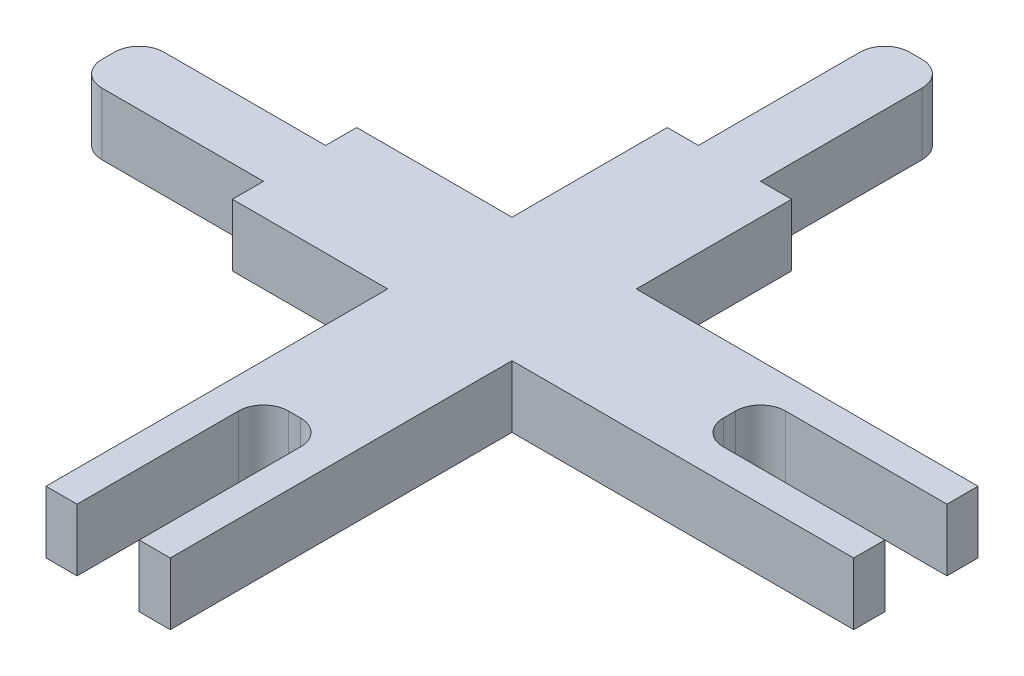
ISO-10303-21;
HEADER;
FILE_DESCRIPTION(('STEP AP214'),'2;1');
FILE_NAME('part.step','',(''),(''),'','','');
FILE_SCHEMA(('AUTOMOTIVE_DESIGN { 1 0 10303 214 1 1 1 1 }'));
ENDSEC;
DATA;
#1=APPLICATION_CONTEXT('core data for automotive mechanical design processes');
#2=APPLICATION_PROTOCOL_DEFINITION('international standard','automotive_design',2000,#1);
#3=PRODUCT_CONTEXT('',#1,'mechanical');
#4=PRODUCT('Part','Part','',(#3));
#5=PRODUCT_RELATED_PRODUCT_CATEGORY('part','',(#4));
#6=PRODUCT_DEFINITION_FORMATION('','',#4);
#7=PRODUCT_DEFINITION_CONTEXT('part definition',#1,'design');
#8=PRODUCT_DEFINITION('design','',#6,#7);
#9=PRODUCT_DEFINITION_SHAPE('','',#8);
#10=(LENGTH_UNIT() NAMED_UNIT(*) SI_UNIT(.MILLI.,.METRE.));
#11=(NAMED_UNIT(*) PLANE_ANGLE_UNIT() SI_UNIT($,.RADIAN.));
#12=(NAMED_UNIT(*) SI_UNIT($,.STERADIAN.) SOLID_ANGLE_UNIT());
#13=UNCERTAINTY_MEASURE_WITH_UNIT(LENGTH_MEASURE(1.E-05),#10,'distance_accuracy_value','');
#14=(GEOMETRIC_REPRESENTATION_CONTEXT(3) GLOBAL_UNCERTAINTY_ASSIGNED_CONTEXT((#13)) GLOBAL_UNIT_ASSIGNED_CONTEXT((#10,
#11,#12)) REPRESENTATION_CONTEXT('',''));
#15=CARTESIAN_POINT('',(0.,0.,0.));
#16=DIRECTION('',(0.,0.,1.));
#17=DIRECTION('',(1.,0.,0.));
#18=AXIS2_PLACEMENT_3D('',#15,#16,#17);
#19=CARTESIAN_POINT('',(0.,2.5,0.));
#20=DIRECTION('',(0.,0.,-1.));
#21=DIRECTION('',(-1.,0.,0.));
#22=AXIS2_PLACEMENT_3D('',#19,#20,#21);
#23=PLANE('',#22);
#24=DIRECTION('',(1.,0.,0.));
#25=VECTOR('',#24,1.);
#26=CARTESIAN_POINT('',(0.,2.5,0.));
#27=LINE('',#26,#25);
#28=CARTESIAN_POINT('',(22.5,2.5,0.));
#29=VERTEX_POINT('',#28);
#30=CARTESIAN_POINT('',(50.,2.5,0.));
#31=VERTEX_POINT('',#30);
#32=EDGE_CURVE('E600',#29,#31,#27,.T.);
#33=ORIENTED_EDGE('',*,*,#32,.F.);
#34=DIRECTION('',(0.,-1.,0.));
#35=VECTOR('',#34,1.);
#36=CARTESIAN_POINT('',(22.5,2.5,0.));
#37=LINE('',#36,#35);
#38=CARTESIAN_POINT('',(22.5,-2.5,0.));
#39=VERTEX_POINT('',#38);
#40=EDGE_CURVE('E472',#29,#39,#37,.T.);
#41=ORIENTED_EDGE('',*,*,#40,.T.);
#42=DIRECTION('',(1.,0.,0.));
#43=VECTOR('',#42,1.);
#44=CARTESIAN_POINT('',(0.,-2.5,0.));
#45=LINE('',#44,#43);
#46=CARTESIAN_POINT('',(50.,-2.5,0.));
#47=VERTEX_POINT('',#46);
#48=EDGE_CURVE('E616',#39,#47,#45,.T.);
#49=ORIENTED_EDGE('',*,*,#48,.T.);
#50=DIRECTION('',(0.,-1.,0.));
#51=VECTOR('',#50,1.);
#52=CARTESIAN_POINT('',(50.,2.5,0.));
#53=LINE('',#52,#51);
#54=EDGE_CURVE('E639',#31,#47,#53,.T.);
#55=ORIENTED_EDGE('',*,*,#54,.F.);
#56=EDGE_LOOP('',(#33,#41,#49,#55));
#57=FACE_BOUND('',#56,.T.);
#58=ADVANCED_FACE('F44',(#57),#23,.F.);
#59=CARTESIAN_POINT('',(0.,2.5,-10.));
#60=DIRECTION('',(0.,0.,1.));
#61=DIRECTION('',(1.,0.,0.));
#62=AXIS2_PLACEMENT_3D('',#59,#60,#61);
#63=PLANE('',#62);
#64=DIRECTION('',(-1.,0.,0.));
#65=VECTOR('',#64,1.);
#66=CARTESIAN_POINT('',(0.,-2.5,-10.));
#67=LINE('',#66,#65);
#68=CARTESIAN_POINT('',(50.,-2.5,-10.));
#69=VERTEX_POINT('',#68);
#70=CARTESIAN_POINT('',(22.5,-2.5,-10.));
#71=VERTEX_POINT('',#70);
#72=EDGE_CURVE('E628',#69,#71,#67,.T.);
#73=ORIENTED_EDGE('',*,*,#72,.T.);
#74=DIRECTION('',(0.,1.,0.));
#75=VECTOR('',#74,1.);
#76=CARTESIAN_POINT('',(22.5,2.5,-10.));
#77=LINE('',#76,#75);
#78=CARTESIAN_POINT('',(22.5,2.5,-10.));
#79=VERTEX_POINT('',#78);
#80=EDGE_CURVE('E11',#71,#79,#77,.T.);
#81=ORIENTED_EDGE('',*,*,#80,.T.);
#82=DIRECTION('',(-1.,0.,0.));
#83=VECTOR('',#82,1.);
#84=CARTESIAN_POINT('',(0.,2.5,-10.));
#85=LINE('',#84,#83);
#86=CARTESIAN_POINT('',(50.,2.5,-10.));
#87=VERTEX_POINT('',#86);
#88=EDGE_CURVE('E606',#87,#79,#85,.T.);
#89=ORIENTED_EDGE('',*,*,#88,.F.);
#90=DIRECTION('',(0.,-1.,0.));
#91=VECTOR('',#90,1.);
#92=CARTESIAN_POINT('',(50.,2.5,-10.));
#93=LINE('',#92,#91);
#94=EDGE_CURVE('E638',#87,#69,#93,.T.);
#95=ORIENTED_EDGE('',*,*,#94,.T.);
#96=EDGE_LOOP('',(#73,#81,#89,#95));
#97=FACE_BOUND('',#96,.T.);
#98=ADVANCED_FACE('F687',(#97),#63,.F.);
#99=CARTESIAN_POINT('',(0.,2.5,0.));
#100=DIRECTION('',(1.,0.,0.));
#101=DIRECTION('',(0.,0.,-1.));
#102=AXIS2_PLACEMENT_3D('',#99,#100,#101);
#103=PLANE('',#102);
#104=DIRECTION('',(0.,1.,0.));
#105=VECTOR('',#104,1.);
#106=CARTESIAN_POINT('',(0.,-2.5,-2.5));
#107=LINE('',#106,#105);
#108=CARTESIAN_POINT('',(0.,-2.5,-2.5));
#109=VERTEX_POINT('',#108);
#110=CARTESIAN_POINT('',(0.,2.5,-2.5));
#111=VERTEX_POINT('',#110);
#112=EDGE_CURVE('E519',#109,#111,#107,.T.);
#113=ORIENTED_EDGE('',*,*,#112,.F.);
#114=DIRECTION('',(0.,0.,1.));
#115=VECTOR('',#114,1.);
#116=CARTESIAN_POINT('',(0.,-2.5,0.));
#117=LINE('',#116,#115);
#118=CARTESIAN_POINT('',(0.,-2.5,0.));
#119=VERTEX_POINT('',#118);
#120=EDGE_CURVE('E576',#109,#119,#117,.T.);
#121=ORIENTED_EDGE('',*,*,#120,.T.);
#122=DIRECTION('',(0.,-1.,0.));
#123=VECTOR('',#122,1.);
#124=CARTESIAN_POINT('',(0.,2.5,0.));
#125=LINE('',#124,#123);
#126=CARTESIAN_POINT('',(0.,2.5,0.));
#127=VERTEX_POINT('',#126);
#128=EDGE_CURVE('E644',#127,#119,#125,.T.);
#129=ORIENTED_EDGE('',*,*,#128,.F.);
#130=DIRECTION('',(0.,0.,1.));
#131=VECTOR('',#130,1.);
#132=CARTESIAN_POINT('',(0.,2.5,0.));
#133=LINE('',#132,#131);
#134=EDGE_CURVE('E598',#111,#127,#133,.T.);
#135=ORIENTED_EDGE('',*,*,#134,.F.);
#136=EDGE_LOOP('',(#113,#121,#129,#135));
#137=FACE_BOUND('',#136,.T.);
#138=ADVANCED_FACE('F758',(#137),#103,.F.);
#139=CARTESIAN_POINT('',(50.,2.5,0.));
#140=DIRECTION('',(-1.,0.,0.));
#141=DIRECTION('',(0.,0.,1.));
#142=AXIS2_PLACEMENT_3D('',#139,#140,#141);
#143=PLANE('',#142);
#144=DIRECTION('',(0.,1.,0.));
#145=VECTOR('',#144,1.);
#146=CARTESIAN_POINT('',(50.,-2.5,-7.5));
#147=LINE('',#146,#145);
#148=CARTESIAN_POINT('',(50.,-2.5,-7.5));
#149=VERTEX_POINT('',#148);
#150=CARTESIAN_POINT('',(50.,2.5,-7.5));
#151=VERTEX_POINT('',#150);
#152=EDGE_CURVE('E559',#149,#151,#147,.T.);
#153=ORIENTED_EDGE('',*,*,#152,.F.);
#154=DIRECTION('',(0.,0.,-1.));
#155=VECTOR('',#154,1.);
#156=CARTESIAN_POINT('',(50.,-2.5,0.));
#157=LINE('',#156,#155);
#158=EDGE_CURVE('E621',#149,#69,#157,.T.);
#159=ORIENTED_EDGE('',*,*,#158,.T.);
#160=ORIENTED_EDGE('',*,*,#94,.F.);
#161=DIRECTION('',(0.,0.,-1.));
#162=VECTOR('',#161,1.);
#163=CARTESIAN_POINT('',(50.,2.5,0.));
#164=LINE('',#163,#162);
#165=EDGE_CURVE('E602',#151,#87,#164,.T.);
#166=ORIENTED_EDGE('',*,*,#165,.F.);
#167=EDGE_LOOP('',(#153,#159,#160,#166));
#168=FACE_BOUND('',#167,.T.);
#169=ADVANCED_FACE('F695',(#168),#143,.F.);
#170=CARTESIAN_POINT('',(0.,2.5,0.));
#171=DIRECTION('',(0.,-1.,0.));
#172=DIRECTION('',(0.,0.,-1.));
#173=AXIS2_PLACEMENT_3D('',#170,#171,#172);
#174=PLANE('',#173);
#175=ORIENTED_EDGE('',*,*,#88,.T.);
#176=DIRECTION('',(0.,0.,-1.));
#177=VECTOR('',#176,1.);
#178=CARTESIAN_POINT('',(22.5,2.5,-22.5));
#179=LINE('',#178,#177);
#180=CARTESIAN_POINT('',(22.5,2.5,-22.5));
#181=VERTEX_POINT('',#180);
#182=EDGE_CURVE('E314',#79,#181,#179,.T.);
#183=ORIENTED_EDGE('',*,*,#182,.T.);
#184=DIRECTION('',(-1.,0.,0.));
#185=VECTOR('',#184,1.);
#186=CARTESIAN_POINT('',(20.,2.5,-22.5));
#187=LINE('',#186,#185);
#188=CARTESIAN_POINT('',(20.,2.5,-22.5));
#189=VERTEX_POINT('',#188);
#190=EDGE_CURVE('E369',#181,#189,#187,.T.);
#191=ORIENTED_EDGE('',*,*,#190,.T.);
#192=DIRECTION('',(0.,0.,-1.));
#193=VECTOR('',#192,1.);
#194=CARTESIAN_POINT('',(20.,2.5,-35.5));
#195=LINE('',#194,#193);
#196=CARTESIAN_POINT('',(20.,2.5,-35.5));
#197=VERTEX_POINT('',#196);
#198=EDGE_CURVE('E283',#189,#197,#195,.T.);
#199=ORIENTED_EDGE('',*,*,#198,.T.);
#200=CARTESIAN_POINT('',(18.,2.5,-35.5));
#201=DIRECTION('',(0.,1.,0.));
#202=DIRECTION('',(0.,0.,-1.));
#203=AXIS2_PLACEMENT_3D('',#200,#201,#202);
#204=CIRCLE('',#203,2.);
#205=CARTESIAN_POINT('',(18.,2.5,-37.5));
#206=VERTEX_POINT('',#205);
#207=EDGE_CURVE('E372',#197,#206,#204,.T.);
#208=ORIENTED_EDGE('',*,*,#207,.T.);
#209=DIRECTION('',(-1.,0.,0.));
#210=VECTOR('',#209,1.);
#211=CARTESIAN_POINT('',(17.,2.5,-37.5));
#212=LINE('',#211,#210);
#213=CARTESIAN_POINT('',(17.,2.5,-37.5));
#214=VERTEX_POINT('',#213);
#215=EDGE_CURVE('E378',#206,#214,#212,.T.);
#216=ORIENTED_EDGE('',*,*,#215,.T.);
#217=CARTESIAN_POINT('',(17.,2.5,-35.5));
#218=DIRECTION('',(0.,1.,0.));
#219=DIRECTION('',(0.,0.,1.));
#220=AXIS2_PLACEMENT_3D('',#217,#218,#219);
#221=CIRCLE('',#220,2.);
#222=CARTESIAN_POINT('',(15.,2.5,-35.5));
#223=VERTEX_POINT('',#222);
#224=EDGE_CURVE('E385',#214,#223,#221,.T.);
#225=ORIENTED_EDGE('',*,*,#224,.T.);
#226=DIRECTION('',(0.,0.,1.));
#227=VECTOR('',#226,1.);
#228=CARTESIAN_POINT('',(15.,2.5,-22.5));
#229=LINE('',#228,#227);
#230=CARTESIAN_POINT('',(15.,2.5,-22.5));
#231=VERTEX_POINT('',#230);
#232=EDGE_CURVE('E387',#223,#231,#229,.T.);
#233=ORIENTED_EDGE('',*,*,#232,.T.);
#234=DIRECTION('',(-1.,0.,0.));
#235=VECTOR('',#234,1.);
#236=CARTESIAN_POINT('',(12.5,2.5,-22.5));
#237=LINE('',#236,#235);
#238=CARTESIAN_POINT('',(12.5,2.5,-22.5));
#239=VERTEX_POINT('',#238);
#240=EDGE_CURVE('E388',#231,#239,#237,.T.);
#241=ORIENTED_EDGE('',*,*,#240,.T.);
#242=DIRECTION('',(0.,0.,1.));
#243=VECTOR('',#242,1.);
#244=CARTESIAN_POINT('',(12.5,2.5,27.5));
#245=LINE('',#244,#243);
#246=CARTESIAN_POINT('',(12.5,2.5,-10.));
#247=VERTEX_POINT('',#246);
#248=EDGE_CURVE('E393',#239,#247,#245,.T.);
#249=ORIENTED_EDGE('',*,*,#248,.T.);
#250=CARTESIAN_POINT('',(0.,2.5,-10.));
#251=VERTEX_POINT('',#250);
#252=EDGE_CURVE('E609',#247,#251,#85,.T.);
#253=ORIENTED_EDGE('',*,*,#252,.T.);
#254=CARTESIAN_POINT('',(0.,2.5,-7.5));
#255=VERTEX_POINT('',#254);
#256=EDGE_CURVE('E593',#251,#255,#133,.T.);
#257=ORIENTED_EDGE('',*,*,#256,.T.);
#258=DIRECTION('',(-1.,0.,0.));
#259=VECTOR('',#258,1.);
#260=CARTESIAN_POINT('',(0.,2.5,-7.5));
#261=LINE('',#260,#259);
#262=CARTESIAN_POINT('',(-13.,2.5,-7.5));
#263=VERTEX_POINT('',#262);
#264=EDGE_CURVE('E478',#255,#263,#261,.T.);
#265=ORIENTED_EDGE('',*,*,#264,.T.);
#266=CARTESIAN_POINT('',(-13.,2.5,-5.5));
#267=DIRECTION('',(0.,1.,0.));
#268=DIRECTION('',(0.,0.,1.));
#269=AXIS2_PLACEMENT_3D('',#266,#267,#268);
#270=CIRCLE('',#269,2.);
#271=CARTESIAN_POINT('',(-15.,2.5,-5.49999999999998));
#272=VERTEX_POINT('',#271);
#273=EDGE_CURVE('E504',#263,#272,#270,.T.);
#274=ORIENTED_EDGE('',*,*,#273,.T.);
#275=DIRECTION('',(0.,0.,1.));
#276=VECTOR('',#275,1.);
#277=CARTESIAN_POINT('',(-15.,2.5,-4.50000000000001));
#278=LINE('',#277,#276);
#279=CARTESIAN_POINT('',(-15.,2.5,-4.50000000000001));
#280=VERTEX_POINT('',#279);
#281=EDGE_CURVE('E502',#272,#280,#278,.T.);
#282=ORIENTED_EDGE('',*,*,#281,.T.);
#283=CARTESIAN_POINT('',(-13.,2.5,-4.5));
#284=DIRECTION('',(0.,1.,0.));
#285=DIRECTION('',(0.,0.,-1.));
#286=AXIS2_PLACEMENT_3D('',#283,#284,#285);
#287=CIRCLE('',#286,2.);
#288=CARTESIAN_POINT('',(-13.,2.5,-2.5));
#289=VERTEX_POINT('',#288);
#290=EDGE_CURVE('E507',#280,#289,#287,.T.);
#291=ORIENTED_EDGE('',*,*,#290,.T.);
#292=DIRECTION('',(1.,0.,0.));
#293=VECTOR('',#292,1.);
#294=CARTESIAN_POINT('',(0.,2.5,-2.5));
#295=LINE('',#294,#293);
#296=EDGE_CURVE('E485',#289,#111,#295,.T.);
#297=ORIENTED_EDGE('',*,*,#296,.T.);
#298=ORIENTED_EDGE('',*,*,#134,.T.);
#299=CARTESIAN_POINT('',(12.5,2.5,0.));
#300=VERTEX_POINT('',#299);
#301=EDGE_CURVE('E597',#127,#300,#27,.T.);
#302=ORIENTED_EDGE('',*,*,#301,.T.);
#303=CARTESIAN_POINT('',(12.5,2.5,27.5));
#304=VERTEX_POINT('',#303);
#305=EDGE_CURVE('E64',#300,#304,#245,.T.);
#306=ORIENTED_EDGE('',*,*,#305,.T.);
#307=DIRECTION('',(1.,0.,0.));
#308=VECTOR('',#307,1.);
#309=CARTESIAN_POINT('',(15.,2.5,27.5));
#310=LINE('',#309,#308);
#311=CARTESIAN_POINT('',(15.,2.5,27.5));
#312=VERTEX_POINT('',#311);
#313=EDGE_CURVE('E396',#304,#312,#310,.T.);
#314=ORIENTED_EDGE('',*,*,#313,.T.);
#315=DIRECTION('',(0.,0.,-1.));
#316=VECTOR('',#315,1.);
#317=CARTESIAN_POINT('',(15.,2.5,14.5));
#318=LINE('',#317,#316);
#319=CARTESIAN_POINT('',(15.,2.5,14.5));
#320=VERTEX_POINT('',#319);
#321=EDGE_CURVE('E405',#312,#320,#318,.T.);
#322=ORIENTED_EDGE('',*,*,#321,.T.);
#323=CARTESIAN_POINT('',(17.,2.5,14.5));
#324=DIRECTION('',(0.,-1.,0.));
#325=DIRECTION('',(0.,0.,1.));
#326=AXIS2_PLACEMENT_3D('',#323,#324,#325);
#327=CIRCLE('',#326,2.);
#328=CARTESIAN_POINT('',(17.,2.5,12.5));
#329=VERTEX_POINT('',#328);
#330=EDGE_CURVE('E409',#320,#329,#327,.T.);
#331=ORIENTED_EDGE('',*,*,#330,.T.);
#332=DIRECTION('',(1.,0.,0.));
#333=VECTOR('',#332,1.);
#334=CARTESIAN_POINT('',(18.,2.5,12.5));
#335=LINE('',#334,#333);
#336=CARTESIAN_POINT('',(18.,2.5,12.5));
#337=VERTEX_POINT('',#336);
#338=EDGE_CURVE('E407',#329,#337,#335,.T.);
#339=ORIENTED_EDGE('',*,*,#338,.T.);
#340=CARTESIAN_POINT('',(18.,2.5,14.5));
#341=DIRECTION('',(0.,-1.,0.));
#342=DIRECTION('',(0.,0.,1.));
#343=AXIS2_PLACEMENT_3D('',#340,#341,#342);
#344=CIRCLE('',#343,2.);
#345=CARTESIAN_POINT('',(20.,2.5,14.5));
#346=VERTEX_POINT('',#345);
#347=EDGE_CURVE('E412',#337,#346,#344,.T.);
#348=ORIENTED_EDGE('',*,*,#347,.T.);
#349=DIRECTION('',(0.,0.,1.));
#350=VECTOR('',#349,1.);
#351=CARTESIAN_POINT('',(20.,2.5,27.5));
#352=LINE('',#351,#350);
#353=CARTESIAN_POINT('',(20.,2.5,27.5));
#354=VERTEX_POINT('',#353);
#355=EDGE_CURVE('E416',#346,#354,#352,.T.);
#356=ORIENTED_EDGE('',*,*,#355,.T.);
#357=DIRECTION('',(1.,0.,0.));
#358=VECTOR('',#357,1.);
#359=CARTESIAN_POINT('',(22.5,2.5,27.5));
#360=LINE('',#359,#358);
#361=CARTESIAN_POINT('',(22.5,2.5,27.5));
#362=VERTEX_POINT('',#361);
#363=EDGE_CURVE('E425',#354,#362,#360,.T.);
#364=ORIENTED_EDGE('',*,*,#363,.T.);
#365=EDGE_CURVE('E309',#362,#29,#179,.T.);
#366=ORIENTED_EDGE('',*,*,#365,.T.);
#367=ORIENTED_EDGE('',*,*,#32,.T.);
#368=CARTESIAN_POINT('',(50.,2.5,-2.5));
#369=VERTEX_POINT('',#368);
#370=EDGE_CURVE('E603',#31,#369,#164,.T.);
#371=ORIENTED_EDGE('',*,*,#370,.T.);
#372=DIRECTION('',(1.,0.,0.));
#373=VECTOR('',#372,1.);
#374=CARTESIAN_POINT('',(50.,2.5,-2.5));
#375=LINE('',#374,#373);
#376=CARTESIAN_POINT('',(37.,2.5,-2.5));
#377=VERTEX_POINT('',#376);
#378=EDGE_CURVE('E539',#377,#369,#375,.T.);
#379=ORIENTED_EDGE('',*,*,#378,.F.);
#380=CARTESIAN_POINT('',(37.,2.5,-4.5));
#381=DIRECTION('',(0.,1.,0.));
#382=DIRECTION('',(0.,0.,-1.));
#383=AXIS2_PLACEMENT_3D('',#380,#381,#382);
#384=CIRCLE('',#383,2.);
#385=CARTESIAN_POINT('',(35.,2.5,-4.50000000000002));
#386=VERTEX_POINT('',#385);
#387=EDGE_CURVE('E566',#386,#377,#384,.T.);
#388=ORIENTED_EDGE('',*,*,#387,.F.);
#389=DIRECTION('',(0.,0.,1.));
#390=VECTOR('',#389,1.);
#391=CARTESIAN_POINT('',(35.,2.5,-5.49999999999998));
#392=LINE('',#391,#390);
#393=CARTESIAN_POINT('',(35.,2.5,-5.49999999999998));
#394=VERTEX_POINT('',#393);
#395=EDGE_CURVE('E562',#394,#386,#392,.T.);
#396=ORIENTED_EDGE('',*,*,#395,.F.);
#397=CARTESIAN_POINT('',(37.,2.5,-5.5));
#398=DIRECTION('',(0.,1.,0.));
#399=DIRECTION('',(0.,0.,1.));
#400=AXIS2_PLACEMENT_3D('',#397,#398,#399);
#401=CIRCLE('',#400,2.);
#402=CARTESIAN_POINT('',(37.,2.5,-7.5));
#403=VERTEX_POINT('',#402);
#404=EDGE_CURVE('E557',#403,#394,#401,.T.);
#405=ORIENTED_EDGE('',*,*,#404,.F.);
#406=DIRECTION('',(-1.,0.,0.));
#407=VECTOR('',#406,1.);
#408=CARTESIAN_POINT('',(50.,2.5,-7.5));
#409=LINE('',#408,#407);
#410=EDGE_CURVE('E518',#151,#403,#409,.T.);
#411=ORIENTED_EDGE('',*,*,#410,.F.);
#412=ORIENTED_EDGE('',*,*,#165,.T.);
#413=EDGE_LOOP('',(#175,#183,#191,#199,#208,#216,#225,#233,#241,#249,#253,#257,#265,#274,#282,
#291,#297,#298,#302,#306,#314,#322,#331,#339,#348,#356,#364,#366,#367,#371,#379,#388,#396,#405,
#411,#412));
#414=FACE_BOUND('',#413,.T.);
#415=ADVANCED_FACE('F679',(#414),#174,.F.);
#416=CARTESIAN_POINT('',(0.,-2.5,0.));
#417=DIRECTION('',(0.,-1.,0.));
#418=DIRECTION('',(0.,0.,-1.));
#419=AXIS2_PLACEMENT_3D('',#416,#417,#418);
#420=PLANE('',#419);
#421=CARTESIAN_POINT('',(12.5,-2.5,-10.));
#422=VERTEX_POINT('',#421);
#423=CARTESIAN_POINT('',(0.,-2.5,-10.));
#424=VERTEX_POINT('',#423);
#425=EDGE_CURVE('E630',#422,#424,#67,.T.);
#426=ORIENTED_EDGE('',*,*,#425,.F.);
#427=DIRECTION('',(0.,0.,1.));
#428=VECTOR('',#427,1.);
#429=CARTESIAN_POINT('',(12.5,-2.5,27.5));
#430=LINE('',#429,#428);
#431=CARTESIAN_POINT('',(12.5,-2.5,-22.5));
#432=VERTEX_POINT('',#431);
#433=EDGE_CURVE('E67',#432,#422,#430,.T.);
#434=ORIENTED_EDGE('',*,*,#433,.F.);
#435=DIRECTION('',(-1.,0.,0.));
#436=VECTOR('',#435,1.);
#437=CARTESIAN_POINT('',(12.5,-2.5,-22.5));
#438=LINE('',#437,#436);
#439=CARTESIAN_POINT('',(15.,-2.5,-22.5));
#440=VERTEX_POINT('',#439);
#441=EDGE_CURVE('E332',#440,#432,#438,.T.);
#442=ORIENTED_EDGE('',*,*,#441,.F.);
#443=DIRECTION('',(0.,0.,1.));
#444=VECTOR('',#443,1.);
#445=CARTESIAN_POINT('',(15.,-2.5,-22.5));
#446=LINE('',#445,#444);
#447=CARTESIAN_POINT('',(15.,-2.5,-35.5));
#448=VERTEX_POINT('',#447);
#449=EDGE_CURVE('E330',#448,#440,#446,.T.);
#450=ORIENTED_EDGE('',*,*,#449,.F.);
#451=CARTESIAN_POINT('',(17.,-2.5,-35.5));
#452=DIRECTION('',(0.,1.,0.));
#453=DIRECTION('',(0.,0.,1.));
#454=AXIS2_PLACEMENT_3D('',#451,#452,#453);
#455=CIRCLE('',#454,2.);
#456=CARTESIAN_POINT('',(17.,-2.5,-37.5));
#457=VERTEX_POINT('',#456);
#458=EDGE_CURVE('E323',#457,#448,#455,.T.);
#459=ORIENTED_EDGE('',*,*,#458,.F.);
#460=DIRECTION('',(-1.,0.,0.));
#461=VECTOR('',#460,1.);
#462=CARTESIAN_POINT('',(17.,-2.5,-37.5));
#463=LINE('',#462,#461);
#464=CARTESIAN_POINT('',(18.,-2.5,-37.5));
#465=VERTEX_POINT('',#464);
#466=EDGE_CURVE('E317',#465,#457,#463,.T.);
#467=ORIENTED_EDGE('',*,*,#466,.F.);
#468=CARTESIAN_POINT('',(18.,-2.5,-35.5));
#469=DIRECTION('',(0.,1.,0.));
#470=DIRECTION('',(0.,0.,-1.));
#471=AXIS2_PLACEMENT_3D('',#468,#469,#470);
#472=CIRCLE('',#471,2.);
#473=CARTESIAN_POINT('',(20.,-2.5,-35.5));
#474=VERTEX_POINT('',#473);
#475=EDGE_CURVE('E305',#474,#465,#472,.T.);
#476=ORIENTED_EDGE('',*,*,#475,.F.);
#477=DIRECTION('',(0.,0.,-1.));
#478=VECTOR('',#477,1.);
#479=CARTESIAN_POINT('',(20.,-2.5,-35.5));
#480=LINE('',#479,#478);
#481=CARTESIAN_POINT('',(20.,-2.5,-22.5));
#482=VERTEX_POINT('',#481);
#483=EDGE_CURVE('E281',#482,#474,#480,.T.);
#484=ORIENTED_EDGE('',*,*,#483,.F.);
#485=DIRECTION('',(-1.,0.,0.));
#486=VECTOR('',#485,1.);
#487=CARTESIAN_POINT('',(20.,-2.5,-22.5));
#488=LINE('',#487,#486);
#489=CARTESIAN_POINT('',(22.5,-2.5,-22.5));
#490=VERTEX_POINT('',#489);
#491=EDGE_CURVE('E298',#490,#482,#488,.T.);
#492=ORIENTED_EDGE('',*,*,#491,.F.);
#493=DIRECTION('',(0.,0.,-1.));
#494=VECTOR('',#493,1.);
#495=CARTESIAN_POINT('',(22.5,-2.5,-22.5));
#496=LINE('',#495,#494);
#497=EDGE_CURVE('E368',#71,#490,#496,.T.);
#498=ORIENTED_EDGE('',*,*,#497,.F.);
#499=ORIENTED_EDGE('',*,*,#72,.F.);
#500=ORIENTED_EDGE('',*,*,#158,.F.);
#501=DIRECTION('',(-1.,0.,0.));
#502=VECTOR('',#501,1.);
#503=CARTESIAN_POINT('',(50.,-2.5,-7.5));
#504=LINE('',#503,#502);
#505=CARTESIAN_POINT('',(37.,-2.5,-7.5));
#506=VERTEX_POINT('',#505);
#507=EDGE_CURVE('E532',#149,#506,#504,.T.);
#508=ORIENTED_EDGE('',*,*,#507,.T.);
#509=CARTESIAN_POINT('',(37.,-2.5,-5.5));
#510=DIRECTION('',(0.,1.,0.));
#511=DIRECTION('',(0.,0.,1.));
#512=AXIS2_PLACEMENT_3D('',#509,#510,#511);
#513=CIRCLE('',#512,2.);
#514=CARTESIAN_POINT('',(35.,-2.5,-5.49999999999998));
#515=VERTEX_POINT('',#514);
#516=EDGE_CURVE('E537',#506,#515,#513,.T.);
#517=ORIENTED_EDGE('',*,*,#516,.T.);
#518=DIRECTION('',(0.,0.,1.));
#519=VECTOR('',#518,1.);
#520=CARTESIAN_POINT('',(35.,-2.5,-5.49999999999998));
#521=LINE('',#520,#519);
#522=CARTESIAN_POINT('',(35.,-2.5,-4.50000000000002));
#523=VERTEX_POINT('',#522);
#524=EDGE_CURVE('E542',#515,#523,#521,.T.);
#525=ORIENTED_EDGE('',*,*,#524,.T.);
#526=CARTESIAN_POINT('',(37.,-2.5,-4.5));
#527=DIRECTION('',(0.,1.,0.));
#528=DIRECTION('',(0.,0.,-1.));
#529=AXIS2_PLACEMENT_3D('',#526,#527,#528);
#530=CIRCLE('',#529,2.);
#531=CARTESIAN_POINT('',(37.,-2.5,-2.5));
#532=VERTEX_POINT('',#531);
#533=EDGE_CURVE('E547',#523,#532,#530,.T.);
#534=ORIENTED_EDGE('',*,*,#533,.T.);
#535=DIRECTION('',(1.,0.,0.));
#536=VECTOR('',#535,1.);
#537=CARTESIAN_POINT('',(50.,-2.5,-2.5));
#538=LINE('',#537,#536);
#539=CARTESIAN_POINT('',(50.,-2.5,-2.5));
#540=VERTEX_POINT('',#539);
#541=EDGE_CURVE('E555',#532,#540,#538,.T.);
#542=ORIENTED_EDGE('',*,*,#541,.T.);
#543=EDGE_CURVE('E624',#47,#540,#157,.T.);
#544=ORIENTED_EDGE('',*,*,#543,.F.);
#545=ORIENTED_EDGE('',*,*,#48,.F.);
#546=CARTESIAN_POINT('',(22.5,-2.5,27.5));
#547=VERTEX_POINT('',#546);
#548=EDGE_CURVE('E292',#547,#39,#496,.T.);
#549=ORIENTED_EDGE('',*,*,#548,.F.);
#550=DIRECTION('',(1.,0.,0.));
#551=VECTOR('',#550,1.);
#552=CARTESIAN_POINT('',(22.5,-2.5,27.5));
#553=LINE('',#552,#551);
#554=CARTESIAN_POINT('',(20.,-2.5,27.5));
#555=VERTEX_POINT('',#554);
#556=EDGE_CURVE('E362',#555,#547,#553,.T.);
#557=ORIENTED_EDGE('',*,*,#556,.F.);
#558=DIRECTION('',(0.,0.,1.));
#559=VECTOR('',#558,1.);
#560=CARTESIAN_POINT('',(20.,-2.5,27.5));
#561=LINE('',#560,#559);
#562=CARTESIAN_POINT('',(20.,-2.5,14.5));
#563=VERTEX_POINT('',#562);
#564=EDGE_CURVE('E356',#563,#555,#561,.T.);
#565=ORIENTED_EDGE('',*,*,#564,.F.);
#566=CARTESIAN_POINT('',(18.,-2.5,14.5));
#567=DIRECTION('',(0.,-1.,0.));
#568=DIRECTION('',(0.,0.,1.));
#569=AXIS2_PLACEMENT_3D('',#566,#567,#568);
#570=CIRCLE('',#569,2.);
#571=CARTESIAN_POINT('',(18.,-2.5,12.5));
#572=VERTEX_POINT('',#571);
#573=EDGE_CURVE('E353',#572,#563,#570,.T.);
#574=ORIENTED_EDGE('',*,*,#573,.F.);
#575=DIRECTION('',(1.,0.,0.));
#576=VECTOR('',#575,1.);
#577=CARTESIAN_POINT('',(18.,-2.5,12.5));
#578=LINE('',#577,#576);
#579=CARTESIAN_POINT('',(17.,-2.5,12.5));
#580=VERTEX_POINT('',#579);
#581=EDGE_CURVE('E348',#580,#572,#578,.T.);
#582=ORIENTED_EDGE('',*,*,#581,.F.);
#583=CARTESIAN_POINT('',(17.,-2.5,14.5));
#584=DIRECTION('',(0.,-1.,0.));
#585=DIRECTION('',(0.,0.,1.));
#586=AXIS2_PLACEMENT_3D('',#583,#584,#585);
#587=CIRCLE('',#586,2.);
#588=CARTESIAN_POINT('',(15.,-2.5,14.5));
#589=VERTEX_POINT('',#588);
#590=EDGE_CURVE('E347',#589,#580,#587,.T.);
#591=ORIENTED_EDGE('',*,*,#590,.F.);
#592=DIRECTION('',(0.,0.,-1.));
#593=VECTOR('',#592,1.);
#594=CARTESIAN_POINT('',(15.,-2.5,14.5));
#595=LINE('',#594,#593);
#596=CARTESIAN_POINT('',(15.,-2.5,27.5));
#597=VERTEX_POINT('',#596);
#598=EDGE_CURVE('E345',#597,#589,#595,.T.);
#599=ORIENTED_EDGE('',*,*,#598,.F.);
#600=DIRECTION('',(1.,0.,0.));
#601=VECTOR('',#600,1.);
#602=CARTESIAN_POINT('',(15.,-2.5,27.5));
#603=LINE('',#602,#601);
#604=CARTESIAN_POINT('',(12.5,-2.5,27.5));
#605=VERTEX_POINT('',#604);
#606=EDGE_CURVE('E340',#605,#597,#603,.T.);
#607=ORIENTED_EDGE('',*,*,#606,.F.);
#608=CARTESIAN_POINT('',(12.5,-2.5,0.));
#609=VERTEX_POINT('',#608);
#610=EDGE_CURVE('E333',#609,#605,#430,.T.);
#611=ORIENTED_EDGE('',*,*,#610,.F.);
#612=EDGE_CURVE('E617',#119,#609,#45,.T.);
#613=ORIENTED_EDGE('',*,*,#612,.F.);
#614=ORIENTED_EDGE('',*,*,#120,.F.);
#615=DIRECTION('',(1.,0.,0.));
#616=VECTOR('',#615,1.);
#617=CARTESIAN_POINT('',(0.,-2.5,-2.5));
#618=LINE('',#617,#616);
#619=CARTESIAN_POINT('',(-13.,-2.5,-2.5));
#620=VERTEX_POINT('',#619);
#621=EDGE_CURVE('E493',#620,#109,#618,.T.);
#622=ORIENTED_EDGE('',*,*,#621,.F.);
#623=CARTESIAN_POINT('',(-13.,-2.5,-4.5));
#624=DIRECTION('',(0.,1.,0.));
#625=DIRECTION('',(0.,0.,-1.));
#626=AXIS2_PLACEMENT_3D('',#623,#624,#625);
#627=CIRCLE('',#626,2.);
#628=CARTESIAN_POINT('',(-15.,-2.5,-4.50000000000001));
#629=VERTEX_POINT('',#628);
#630=EDGE_CURVE('E489',#629,#620,#627,.T.);
#631=ORIENTED_EDGE('',*,*,#630,.F.);
#632=DIRECTION('',(0.,0.,1.));
#633=VECTOR('',#632,1.);
#634=CARTESIAN_POINT('',(-15.,-2.5,-4.50000000000001));
#635=LINE('',#634,#633);
#636=CARTESIAN_POINT('',(-15.,-2.5,-5.49999999999998));
#637=VERTEX_POINT('',#636);
#638=EDGE_CURVE('E486',#637,#629,#635,.T.);
#639=ORIENTED_EDGE('',*,*,#638,.F.);
#640=CARTESIAN_POINT('',(-13.,-2.5,-5.5));
#641=DIRECTION('',(0.,1.,0.));
#642=DIRECTION('',(0.,0.,1.));
#643=AXIS2_PLACEMENT_3D('',#640,#641,#642);
#644=CIRCLE('',#643,2.);
#645=CARTESIAN_POINT('',(-13.,-2.5,-7.5));
#646=VERTEX_POINT('',#645);
#647=EDGE_CURVE('E481',#646,#637,#644,.T.);
#648=ORIENTED_EDGE('',*,*,#647,.F.);
#649=DIRECTION('',(-1.,0.,0.));
#650=VECTOR('',#649,1.);
#651=CARTESIAN_POINT('',(0.,-2.5,-7.5));
#652=LINE('',#651,#650);
#653=CARTESIAN_POINT('',(0.,-2.5,-7.5));
#654=VERTEX_POINT('',#653);
#655=EDGE_CURVE('E480',#654,#646,#652,.T.);
#656=ORIENTED_EDGE('',*,*,#655,.F.);
#657=EDGE_CURVE('E613',#424,#654,#117,.T.);
#658=ORIENTED_EDGE('',*,*,#657,.F.);
#659=EDGE_LOOP('',(#426,#434,#442,#450,#459,#467,#476,#484,#492,#498,#499,#500,#508,#517,#525,
#534,#542,#544,#545,#549,#557,#565,#574,#582,#591,#599,#607,#611,#613,#614,#622,#631,#639,#648,
#656,#658));
#660=FACE_BOUND('',#659,.T.);
#661=ADVANCED_FACE('F296',(#660),#420,.T.);
#662=ORIENTED_EDGE('',*,*,#657,.T.);
#663=DIRECTION('',(0.,1.,0.));
#664=VECTOR('',#663,1.);
#665=CARTESIAN_POINT('',(0.,-2.5,-7.5));
#666=LINE('',#665,#664);
#667=EDGE_CURVE('E500',#654,#255,#666,.T.);
#668=ORIENTED_EDGE('',*,*,#667,.T.);
#669=ORIENTED_EDGE('',*,*,#256,.F.);
#670=DIRECTION('',(0.,-1.,0.));
#671=VECTOR('',#670,1.);
#672=CARTESIAN_POINT('',(0.,2.5,-10.));
#673=LINE('',#672,#671);
#674=EDGE_CURVE('E615',#251,#424,#673,.T.);
#675=ORIENTED_EDGE('',*,*,#674,.T.);
#676=EDGE_LOOP('',(#662,#668,#669,#675));
#677=FACE_BOUND('',#676,.T.);
#678=ADVANCED_FACE('F50',(#677),#103,.F.);
#679=ORIENTED_EDGE('',*,*,#612,.T.);
#680=DIRECTION('',(0.,1.,0.));
#681=VECTOR('',#680,1.);
#682=CARTESIAN_POINT('',(12.5,2.5,0.));
#683=LINE('',#682,#681);
#684=EDGE_CURVE('E428',#609,#300,#683,.T.);
#685=ORIENTED_EDGE('',*,*,#684,.T.);
#686=ORIENTED_EDGE('',*,*,#301,.F.);
#687=ORIENTED_EDGE('',*,*,#128,.T.);
#688=EDGE_LOOP('',(#679,#685,#686,#687));
#689=FACE_BOUND('',#688,.T.);
#690=ADVANCED_FACE('F751',(#689),#23,.F.);
#691=ORIENTED_EDGE('',*,*,#543,.T.);
#692=DIRECTION('',(0.,1.,0.));
#693=VECTOR('',#692,1.);
#694=CARTESIAN_POINT('',(50.,-2.5,-2.5));
#695=LINE('',#694,#693);
#696=EDGE_CURVE('E573',#540,#369,#695,.T.);
#697=ORIENTED_EDGE('',*,*,#696,.T.);
#698=ORIENTED_EDGE('',*,*,#370,.F.);
#699=ORIENTED_EDGE('',*,*,#54,.T.);
#700=EDGE_LOOP('',(#691,#697,#698,#699));
#701=FACE_BOUND('',#700,.T.);
#702=ADVANCED_FACE('F720',(#701),#143,.F.);
#703=ORIENTED_EDGE('',*,*,#252,.F.);
#704=DIRECTION('',(0.,-1.,0.));
#705=VECTOR('',#704,1.);
#706=CARTESIAN_POINT('',(12.5,2.5,-10.));
#707=LINE('',#706,#705);
#708=EDGE_CURVE('E53',#247,#422,#707,.T.);
#709=ORIENTED_EDGE('',*,*,#708,.T.);
#710=ORIENTED_EDGE('',*,*,#425,.T.);
#711=ORIENTED_EDGE('',*,*,#674,.F.);
#712=EDGE_LOOP('',(#703,#709,#710,#711));
#713=FACE_BOUND('',#712,.T.);
#714=ADVANCED_FACE('F649',(#713),#63,.F.);
#715=CARTESIAN_POINT('',(50.,-2.5,-2.5));
#716=DIRECTION('',(0.,0.,1.));
#717=DIRECTION('',(1.,0.,0.));
#718=AXIS2_PLACEMENT_3D('',#715,#716,#717);
#719=PLANE('',#718);
#720=ORIENTED_EDGE('',*,*,#378,.T.);
#721=ORIENTED_EDGE('',*,*,#696,.F.);
#722=ORIENTED_EDGE('',*,*,#541,.F.);
#723=DIRECTION('',(0.,1.,0.));
#724=VECTOR('',#723,1.);
#725=CARTESIAN_POINT('',(37.,-2.5,-2.5));
#726=LINE('',#725,#724);
#727=EDGE_CURVE('E577',#532,#377,#726,.T.);
#728=ORIENTED_EDGE('',*,*,#727,.T.);
#729=EDGE_LOOP('',(#720,#721,#722,#728));
#730=FACE_BOUND('',#729,.T.);
#731=ADVANCED_FACE('F713',(#730),#719,.F.);
#732=CARTESIAN_POINT('',(37.,-2.5,-4.5));
#733=DIRECTION('',(0.,1.,0.));
#734=DIRECTION('',(0.,0.,1.));
#735=AXIS2_PLACEMENT_3D('',#732,#733,#734);
#736=CYLINDRICAL_SURFACE('',#735,2.);
#737=ORIENTED_EDGE('',*,*,#387,.T.);
#738=ORIENTED_EDGE('',*,*,#727,.F.);
#739=ORIENTED_EDGE('',*,*,#533,.F.);
#740=DIRECTION('',(0.,1.,0.));
#741=VECTOR('',#740,1.);
#742=CARTESIAN_POINT('',(35.,-2.5,-4.50000000000002));
#743=LINE('',#742,#741);
#744=EDGE_CURVE('E582',#523,#386,#743,.T.);
#745=ORIENTED_EDGE('',*,*,#744,.T.);
#746=EDGE_LOOP('',(#737,#738,#739,#745));
#747=FACE_BOUND('',#746,.T.);
#748=ADVANCED_FACE('F709',(#747),#736,.F.);
#749=CARTESIAN_POINT('',(35.,-2.5,-5.49999999999998));
#750=DIRECTION('',(-1.,0.,0.));
#751=DIRECTION('',(0.,0.,1.));
#752=AXIS2_PLACEMENT_3D('',#749,#750,#751);
#753=PLANE('',#752);
#754=ORIENTED_EDGE('',*,*,#395,.T.);
#755=ORIENTED_EDGE('',*,*,#744,.F.);
#756=ORIENTED_EDGE('',*,*,#524,.F.);
#757=DIRECTION('',(0.,1.,0.));
#758=VECTOR('',#757,1.);
#759=CARTESIAN_POINT('',(35.,-2.5,-5.49999999999998));
#760=LINE('',#759,#758);
#761=EDGE_CURVE('E584',#515,#394,#760,.T.);
#762=ORIENTED_EDGE('',*,*,#761,.T.);
#763=EDGE_LOOP('',(#754,#755,#756,#762));
#764=FACE_BOUND('',#763,.T.);
#765=ADVANCED_FACE('F706',(#764),#753,.F.);
#766=CARTESIAN_POINT('',(37.,-2.5,-5.5));
#767=DIRECTION('',(0.,1.,0.));
#768=DIRECTION('',(0.,0.,1.));
#769=AXIS2_PLACEMENT_3D('',#766,#767,#768);
#770=CYLINDRICAL_SURFACE('',#769,2.);
#771=ORIENTED_EDGE('',*,*,#404,.T.);
#772=ORIENTED_EDGE('',*,*,#761,.F.);
#773=ORIENTED_EDGE('',*,*,#516,.F.);
#774=DIRECTION('',(0.,1.,0.));
#775=VECTOR('',#774,1.);
#776=CARTESIAN_POINT('',(37.,-2.5,-7.5));
#777=LINE('',#776,#775);
#778=EDGE_CURVE('E586',#506,#403,#777,.T.);
#779=ORIENTED_EDGE('',*,*,#778,.T.);
#780=EDGE_LOOP('',(#771,#772,#773,#779));
#781=FACE_BOUND('',#780,.T.);
#782=ADVANCED_FACE('F701',(#781),#770,.F.);
#783=CARTESIAN_POINT('',(50.,-2.5,-7.5));
#784=DIRECTION('',(0.,0.,-1.));
#785=DIRECTION('',(-1.,0.,0.));
#786=AXIS2_PLACEMENT_3D('',#783,#784,#785);
#787=PLANE('',#786);
#788=ORIENTED_EDGE('',*,*,#410,.T.);
#789=ORIENTED_EDGE('',*,*,#778,.F.);
#790=ORIENTED_EDGE('',*,*,#507,.F.);
#791=ORIENTED_EDGE('',*,*,#152,.T.);
#792=EDGE_LOOP('',(#788,#789,#790,#791));
#793=FACE_BOUND('',#792,.T.);
#794=ADVANCED_FACE('F700',(#793),#787,.F.);
#795=CARTESIAN_POINT('',(0.,-2.5,-2.5));
#796=DIRECTION('',(0.,0.,1.));
#797=DIRECTION('',(1.,0.,0.));
#798=AXIS2_PLACEMENT_3D('',#795,#796,#797);
#799=PLANE('',#798);
#800=ORIENTED_EDGE('',*,*,#296,.F.);
#801=DIRECTION('',(0.,1.,0.));
#802=VECTOR('',#801,1.);
#803=CARTESIAN_POINT('',(-13.,-2.5,-2.5));
#804=LINE('',#803,#802);
#805=EDGE_CURVE('E517',#620,#289,#804,.T.);
#806=ORIENTED_EDGE('',*,*,#805,.F.);
#807=ORIENTED_EDGE('',*,*,#621,.T.);
#808=ORIENTED_EDGE('',*,*,#112,.T.);
#809=EDGE_LOOP('',(#800,#806,#807,#808));
#810=FACE_BOUND('',#809,.T.);
#811=ADVANCED_FACE('F778',(#810),#799,.T.);
#812=CARTESIAN_POINT('',(-13.,-2.5,-4.5));
#813=DIRECTION('',(0.,1.,0.));
#814=DIRECTION('',(0.,0.,1.));
#815=AXIS2_PLACEMENT_3D('',#812,#813,#814);
#816=CYLINDRICAL_SURFACE('',#815,2.);
#817=ORIENTED_EDGE('',*,*,#290,.F.);
#818=DIRECTION('',(0.,1.,0.));
#819=VECTOR('',#818,1.);
#820=CARTESIAN_POINT('',(-15.,-2.5,-4.50000000000001));
#821=LINE('',#820,#819);
#822=EDGE_CURVE('E521',#629,#280,#821,.T.);
#823=ORIENTED_EDGE('',*,*,#822,.F.);
#824=ORIENTED_EDGE('',*,*,#630,.T.);
#825=ORIENTED_EDGE('',*,*,#805,.T.);
#826=EDGE_LOOP('',(#817,#823,#824,#825));
#827=FACE_BOUND('',#826,.T.);
#828=ADVANCED_FACE('F781',(#827),#816,.T.);
#829=CARTESIAN_POINT('',(-15.,-2.5,-4.50000000000001));
#830=DIRECTION('',(-1.,0.,0.));
#831=DIRECTION('',(0.,0.,1.));
#832=AXIS2_PLACEMENT_3D('',#829,#830,#831);
#833=PLANE('',#832);
#834=ORIENTED_EDGE('',*,*,#281,.F.);
#835=DIRECTION('',(0.,1.,0.));
#836=VECTOR('',#835,1.);
#837=CARTESIAN_POINT('',(-15.,-2.5,-5.49999999999998));
#838=LINE('',#837,#836);
#839=EDGE_CURVE('E528',#637,#272,#838,.T.);
#840=ORIENTED_EDGE('',*,*,#839,.F.);
#841=ORIENTED_EDGE('',*,*,#638,.T.);
#842=ORIENTED_EDGE('',*,*,#822,.T.);
#843=EDGE_LOOP('',(#834,#840,#841,#842));
#844=FACE_BOUND('',#843,.T.);
#845=ADVANCED_FACE('F790',(#844),#833,.T.);
#846=CARTESIAN_POINT('',(-13.,-2.5,-5.5));
#847=DIRECTION('',(0.,1.,0.));
#848=DIRECTION('',(0.,0.,1.));
#849=AXIS2_PLACEMENT_3D('',#846,#847,#848);
#850=CYLINDRICAL_SURFACE('',#849,2.);
#851=ORIENTED_EDGE('',*,*,#273,.F.);
#852=DIRECTION('',(0.,1.,0.));
#853=VECTOR('',#852,1.);
#854=CARTESIAN_POINT('',(-13.,-2.5,-7.5));
#855=LINE('',#854,#853);
#856=EDGE_CURVE('E530',#646,#263,#855,.T.);
#857=ORIENTED_EDGE('',*,*,#856,.F.);
#858=ORIENTED_EDGE('',*,*,#647,.T.);
#859=ORIENTED_EDGE('',*,*,#839,.T.);
#860=EDGE_LOOP('',(#851,#857,#858,#859));
#861=FACE_BOUND('',#860,.T.);
#862=ADVANCED_FACE('F788',(#861),#850,.T.);
#863=CARTESIAN_POINT('',(0.,-2.5,-7.5));
#864=DIRECTION('',(0.,0.,-1.));
#865=DIRECTION('',(-1.,0.,0.));
#866=AXIS2_PLACEMENT_3D('',#863,#864,#865);
#867=PLANE('',#866);
#868=ORIENTED_EDGE('',*,*,#264,.F.);
#869=ORIENTED_EDGE('',*,*,#667,.F.);
#870=ORIENTED_EDGE('',*,*,#655,.T.);
#871=ORIENTED_EDGE('',*,*,#856,.T.);
#872=EDGE_LOOP('',(#868,#869,#870,#871));
#873=FACE_BOUND('',#872,.T.);
#874=ADVANCED_FACE('F791',(#873),#867,.T.);
#875=CARTESIAN_POINT('',(20.,-2.5,-35.5));
#876=DIRECTION('',(1.,0.,0.));
#877=DIRECTION('',(0.,0.,-1.));
#878=AXIS2_PLACEMENT_3D('',#875,#876,#877);
#879=PLANE('',#878);
#880=ORIENTED_EDGE('',*,*,#198,.F.);
#881=DIRECTION('',(0.,1.,0.));
#882=VECTOR('',#881,1.);
#883=CARTESIAN_POINT('',(20.,-2.5,-22.5));
#884=LINE('',#883,#882);
#885=EDGE_CURVE('E276',#482,#189,#884,.T.);
#886=ORIENTED_EDGE('',*,*,#885,.F.);
#887=ORIENTED_EDGE('',*,*,#483,.T.);
#888=DIRECTION('',(0.,1.,0.));
#889=VECTOR('',#888,1.);
#890=CARTESIAN_POINT('',(20.,-2.5,-35.5));
#891=LINE('',#890,#889);
#892=EDGE_CURVE('E289',#474,#197,#891,.T.);
#893=ORIENTED_EDGE('',*,*,#892,.T.);
#894=EDGE_LOOP('',(#880,#886,#887,#893));
#895=FACE_BOUND('',#894,.T.);
#896=ADVANCED_FACE('F284',(#895),#879,.T.);
#897=CARTESIAN_POINT('',(18.,-2.5,-35.5));
#898=DIRECTION('',(0.,1.,0.));
#899=DIRECTION('',(0.,0.,1.));
#900=AXIS2_PLACEMENT_3D('',#897,#898,#899);
#901=CYLINDRICAL_SURFACE('',#900,2.);
#902=ORIENTED_EDGE('',*,*,#207,.F.);
#903=ORIENTED_EDGE('',*,*,#892,.F.);
#904=ORIENTED_EDGE('',*,*,#475,.T.);
#905=DIRECTION('',(0.,1.,0.));
#906=VECTOR('',#905,1.);
#907=CARTESIAN_POINT('',(18.,-2.5,-37.5));
#908=LINE('',#907,#906);
#909=EDGE_CURVE('E462',#465,#206,#908,.T.);
#910=ORIENTED_EDGE('',*,*,#909,.T.);
#911=EDGE_LOOP('',(#902,#903,#904,#910));
#912=FACE_BOUND('',#911,.T.);
#913=ADVANCED_FACE('F813',(#912),#901,.T.);
#914=CARTESIAN_POINT('',(17.,-2.5,-37.5));
#915=DIRECTION('',(0.,0.,-1.));
#916=DIRECTION('',(-1.,0.,0.));
#917=AXIS2_PLACEMENT_3D('',#914,#915,#916);
#918=PLANE('',#917);
#919=ORIENTED_EDGE('',*,*,#215,.F.);
#920=ORIENTED_EDGE('',*,*,#909,.F.);
#921=ORIENTED_EDGE('',*,*,#466,.T.);
#922=DIRECTION('',(0.,1.,0.));
#923=VECTOR('',#922,1.);
#924=CARTESIAN_POINT('',(17.,-2.5,-37.5));
#925=LINE('',#924,#923);
#926=EDGE_CURVE('E461',#457,#214,#925,.T.);
#927=ORIENTED_EDGE('',*,*,#926,.T.);
#928=EDGE_LOOP('',(#919,#920,#921,#927));
#929=FACE_BOUND('',#928,.T.);
#930=ADVANCED_FACE('F807',(#929),#918,.T.);
#931=CARTESIAN_POINT('',(17.,-2.5,-35.5));
#932=DIRECTION('',(0.,1.,0.));
#933=DIRECTION('',(0.,0.,1.));
#934=AXIS2_PLACEMENT_3D('',#931,#932,#933);
#935=CYLINDRICAL_SURFACE('',#934,2.);
#936=ORIENTED_EDGE('',*,*,#224,.F.);
#937=ORIENTED_EDGE('',*,*,#926,.F.);
#938=ORIENTED_EDGE('',*,*,#458,.T.);
#939=DIRECTION('',(0.,1.,0.));
#940=VECTOR('',#939,1.);
#941=CARTESIAN_POINT('',(15.,-2.5,-35.5));
#942=LINE('',#941,#940);
#943=EDGE_CURVE('E459',#448,#223,#942,.T.);
#944=ORIENTED_EDGE('',*,*,#943,.T.);
#945=EDGE_LOOP('',(#936,#937,#938,#944));
#946=FACE_BOUND('',#945,.T.);
#947=ADVANCED_FACE('F810',(#946),#935,.T.);
#948=CARTESIAN_POINT('',(15.,-2.5,-22.5));
#949=DIRECTION('',(-1.,0.,0.));
#950=DIRECTION('',(0.,0.,1.));
#951=AXIS2_PLACEMENT_3D('',#948,#949,#950);
#952=PLANE('',#951);
#953=ORIENTED_EDGE('',*,*,#232,.F.);
#954=ORIENTED_EDGE('',*,*,#943,.F.);
#955=ORIENTED_EDGE('',*,*,#449,.T.);
#956=DIRECTION('',(0.,1.,0.));
#957=VECTOR('',#956,1.);
#958=CARTESIAN_POINT('',(15.,-2.5,-22.5));
#959=LINE('',#958,#957);
#960=EDGE_CURVE('E457',#440,#231,#959,.T.);
#961=ORIENTED_EDGE('',*,*,#960,.T.);
#962=EDGE_LOOP('',(#953,#954,#955,#961));
#963=FACE_BOUND('',#962,.T.);
#964=ADVANCED_FACE('F805',(#963),#952,.T.);
#965=CARTESIAN_POINT('',(20.,-2.5,-22.5));
#966=DIRECTION('',(0.,0.,-1.));
#967=DIRECTION('',(-1.,0.,0.));
#968=AXIS2_PLACEMENT_3D('',#965,#966,#967);
#969=PLANE('',#968);
#970=ORIENTED_EDGE('',*,*,#190,.F.);
#971=DIRECTION('',(0.,1.,0.));
#972=VECTOR('',#971,1.);
#973=CARTESIAN_POINT('',(22.5,-2.5,-22.5));
#974=LINE('',#973,#972);
#975=EDGE_CURVE('E306',#490,#181,#974,.T.);
#976=ORIENTED_EDGE('',*,*,#975,.F.);
#977=ORIENTED_EDGE('',*,*,#491,.T.);
#978=ORIENTED_EDGE('',*,*,#885,.T.);
#979=EDGE_LOOP('',(#970,#976,#977,#978));
#980=FACE_BOUND('',#979,.T.);
#981=ADVANCED_FACE('F308',(#980),#969,.T.);
#982=CARTESIAN_POINT('',(12.5,-2.5,-22.5));
#983=DIRECTION('',(0.,0.,-1.));
#984=DIRECTION('',(-1.,0.,0.));
#985=AXIS2_PLACEMENT_3D('',#982,#983,#984);
#986=PLANE('',#985);
#987=ORIENTED_EDGE('',*,*,#240,.F.);
#988=ORIENTED_EDGE('',*,*,#960,.F.);
#989=ORIENTED_EDGE('',*,*,#441,.T.);
#990=DIRECTION('',(0.,1.,0.));
#991=VECTOR('',#990,1.);
#992=CARTESIAN_POINT('',(12.5,-2.5,-22.5));
#993=LINE('',#992,#991);
#994=EDGE_CURVE('E451',#432,#239,#993,.T.);
#995=ORIENTED_EDGE('',*,*,#994,.T.);
#996=EDGE_LOOP('',(#987,#988,#989,#995));
#997=FACE_BOUND('',#996,.T.);
#998=ADVANCED_FACE('F797',(#997),#986,.T.);
#999=CARTESIAN_POINT('',(12.5,-2.5,27.5));
#1000=DIRECTION('',(-1.,0.,0.));
#1001=DIRECTION('',(0.,0.,1.));
#1002=AXIS2_PLACEMENT_3D('',#999,#1000,#1001);
#1003=PLANE('',#1002);
#1004=ORIENTED_EDGE('',*,*,#708,.F.);
#1005=ORIENTED_EDGE('',*,*,#248,.F.);
#1006=ORIENTED_EDGE('',*,*,#994,.F.);
#1007=ORIENTED_EDGE('',*,*,#433,.T.);
#1008=EDGE_LOOP('',(#1004,#1005,#1006,#1007));
#1009=FACE_BOUND('',#1008,.T.);
#1010=ADVANCED_FACE('F800',(#1009),#1003,.T.);
#1011=CARTESIAN_POINT('',(22.5,-2.5,-22.5));
#1012=DIRECTION('',(1.,0.,0.));
#1013=DIRECTION('',(0.,0.,-1.));
#1014=AXIS2_PLACEMENT_3D('',#1011,#1012,#1013);
#1015=PLANE('',#1014);
#1016=ORIENTED_EDGE('',*,*,#80,.F.);
#1017=ORIENTED_EDGE('',*,*,#497,.T.);
#1018=ORIENTED_EDGE('',*,*,#975,.T.);
#1019=ORIENTED_EDGE('',*,*,#182,.F.);
#1020=EDGE_LOOP('',(#1016,#1017,#1018,#1019));
#1021=FACE_BOUND('',#1020,.T.);
#1022=ADVANCED_FACE('F682',(#1021),#1015,.T.);
#1023=ORIENTED_EDGE('',*,*,#40,.F.);
#1024=ORIENTED_EDGE('',*,*,#365,.F.);
#1025=DIRECTION('',(0.,1.,0.));
#1026=VECTOR('',#1025,1.);
#1027=CARTESIAN_POINT('',(22.5,-2.5,27.5));
#1028=LINE('',#1027,#1026);
#1029=EDGE_CURVE('E427',#547,#362,#1028,.T.);
#1030=ORIENTED_EDGE('',*,*,#1029,.F.);
#1031=ORIENTED_EDGE('',*,*,#548,.T.);
#1032=EDGE_LOOP('',(#1023,#1024,#1030,#1031));
#1033=FACE_BOUND('',#1032,.T.);
#1034=ADVANCED_FACE('F726',(#1033),#1015,.T.);
#1035=ORIENTED_EDGE('',*,*,#684,.F.);
#1036=ORIENTED_EDGE('',*,*,#610,.T.);
#1037=DIRECTION('',(0.,1.,0.));
#1038=VECTOR('',#1037,1.);
#1039=CARTESIAN_POINT('',(12.5,-2.5,27.5));
#1040=LINE('',#1039,#1038);
#1041=EDGE_CURVE('E447',#605,#304,#1040,.T.);
#1042=ORIENTED_EDGE('',*,*,#1041,.T.);
#1043=ORIENTED_EDGE('',*,*,#305,.F.);
#1044=EDGE_LOOP('',(#1035,#1036,#1042,#1043));
#1045=FACE_BOUND('',#1044,.T.);
#1046=ADVANCED_FACE('F663',(#1045),#1003,.T.);
#1047=CARTESIAN_POINT('',(22.5,-2.5,27.5));
#1048=DIRECTION('',(0.,0.,1.));
#1049=DIRECTION('',(1.,0.,0.));
#1050=AXIS2_PLACEMENT_3D('',#1047,#1048,#1049);
#1051=PLANE('',#1050);
#1052=ORIENTED_EDGE('',*,*,#363,.F.);
#1053=DIRECTION('',(0.,1.,0.));
#1054=VECTOR('',#1053,1.);
#1055=CARTESIAN_POINT('',(20.,-2.5,27.5));
#1056=LINE('',#1055,#1054);
#1057=EDGE_CURVE('E435',#555,#354,#1056,.T.);
#1058=ORIENTED_EDGE('',*,*,#1057,.F.);
#1059=ORIENTED_EDGE('',*,*,#556,.T.);
#1060=ORIENTED_EDGE('',*,*,#1029,.T.);
#1061=EDGE_LOOP('',(#1052,#1058,#1059,#1060));
#1062=FACE_BOUND('',#1061,.T.);
#1063=ADVANCED_FACE('F732',(#1062),#1051,.T.);
#1064=CARTESIAN_POINT('',(20.,-2.5,27.5));
#1065=DIRECTION('',(-1.,0.,0.));
#1066=DIRECTION('',(0.,0.,1.));
#1067=AXIS2_PLACEMENT_3D('',#1064,#1065,#1066);
#1068=PLANE('',#1067);
#1069=ORIENTED_EDGE('',*,*,#355,.F.);
#1070=DIRECTION('',(0.,1.,0.));
#1071=VECTOR('',#1070,1.);
#1072=CARTESIAN_POINT('',(20.,-2.5,14.5));
#1073=LINE('',#1072,#1071);
#1074=EDGE_CURVE('E434',#563,#346,#1073,.T.);
#1075=ORIENTED_EDGE('',*,*,#1074,.F.);
#1076=ORIENTED_EDGE('',*,*,#564,.T.);
#1077=ORIENTED_EDGE('',*,*,#1057,.T.);
#1078=EDGE_LOOP('',(#1069,#1075,#1076,#1077));
#1079=FACE_BOUND('',#1078,.T.);
#1080=ADVANCED_FACE('F734',(#1079),#1068,.T.);
#1081=CARTESIAN_POINT('',(18.,-2.5,14.5));
#1082=DIRECTION('',(0.,1.,0.));
#1083=DIRECTION('',(0.,0.,1.));
#1084=AXIS2_PLACEMENT_3D('',#1081,#1082,#1083);
#1085=CYLINDRICAL_SURFACE('',#1084,2.);
#1086=ORIENTED_EDGE('',*,*,#347,.F.);
#1087=DIRECTION('',(0.,1.,0.));
#1088=VECTOR('',#1087,1.);
#1089=CARTESIAN_POINT('',(18.,-2.5,12.5));
#1090=LINE('',#1089,#1088);
#1091=EDGE_CURVE('E437',#572,#337,#1090,.T.);
#1092=ORIENTED_EDGE('',*,*,#1091,.F.);
#1093=ORIENTED_EDGE('',*,*,#573,.T.);
#1094=ORIENTED_EDGE('',*,*,#1074,.T.);
#1095=EDGE_LOOP('',(#1086,#1092,#1093,#1094));
#1096=FACE_BOUND('',#1095,.T.);
#1097=ADVANCED_FACE('F740',(#1096),#1085,.F.);
#1098=CARTESIAN_POINT('',(18.,-2.5,12.5));
#1099=DIRECTION('',(0.,0.,1.));
#1100=DIRECTION('',(1.,0.,0.));
#1101=AXIS2_PLACEMENT_3D('',#1098,#1099,#1100);
#1102=PLANE('',#1101);
#1103=ORIENTED_EDGE('',*,*,#338,.F.);
#1104=DIRECTION('',(0.,1.,0.));
#1105=VECTOR('',#1104,1.);
#1106=CARTESIAN_POINT('',(17.,-2.5,12.5));
#1107=LINE('',#1106,#1105);
#1108=EDGE_CURVE('E442',#580,#329,#1107,.T.);
#1109=ORIENTED_EDGE('',*,*,#1108,.F.);
#1110=ORIENTED_EDGE('',*,*,#581,.T.);
#1111=ORIENTED_EDGE('',*,*,#1091,.T.);
#1112=EDGE_LOOP('',(#1103,#1109,#1110,#1111));
#1113=FACE_BOUND('',#1112,.T.);
#1114=ADVANCED_FACE('F743',(#1113),#1102,.T.);
#1115=CARTESIAN_POINT('',(17.,-2.5,14.5));
#1116=DIRECTION('',(0.,1.,0.));
#1117=DIRECTION('',(0.,0.,1.));
#1118=AXIS2_PLACEMENT_3D('',#1115,#1116,#1117);
#1119=CYLINDRICAL_SURFACE('',#1118,2.);
#1120=ORIENTED_EDGE('',*,*,#330,.F.);
#1121=DIRECTION('',(0.,1.,0.));
#1122=VECTOR('',#1121,1.);
#1123=CARTESIAN_POINT('',(15.,-2.5,14.5));
#1124=LINE('',#1123,#1122);
#1125=EDGE_CURVE('E441',#589,#320,#1124,.T.);
#1126=ORIENTED_EDGE('',*,*,#1125,.F.);
#1127=ORIENTED_EDGE('',*,*,#590,.T.);
#1128=ORIENTED_EDGE('',*,*,#1108,.T.);
#1129=EDGE_LOOP('',(#1120,#1126,#1127,#1128));
#1130=FACE_BOUND('',#1129,.T.);
#1131=ADVANCED_FACE('F741',(#1130),#1119,.F.);
#1132=CARTESIAN_POINT('',(15.,-2.5,14.5));
#1133=DIRECTION('',(1.,0.,0.));
#1134=DIRECTION('',(0.,0.,-1.));
#1135=AXIS2_PLACEMENT_3D('',#1132,#1133,#1134);
#1136=PLANE('',#1135);
#1137=ORIENTED_EDGE('',*,*,#321,.F.);
#1138=DIRECTION('',(0.,1.,0.));
#1139=VECTOR('',#1138,1.);
#1140=CARTESIAN_POINT('',(15.,-2.5,27.5));
#1141=LINE('',#1140,#1139);
#1142=EDGE_CURVE('E446',#597,#312,#1141,.T.);
#1143=ORIENTED_EDGE('',*,*,#1142,.F.);
#1144=ORIENTED_EDGE('',*,*,#598,.T.);
#1145=ORIENTED_EDGE('',*,*,#1125,.T.);
#1146=EDGE_LOOP('',(#1137,#1143,#1144,#1145));
#1147=FACE_BOUND('',#1146,.T.);
#1148=ADVANCED_FACE('F677',(#1147),#1136,.T.);
#1149=CARTESIAN_POINT('',(15.,-2.5,27.5));
#1150=DIRECTION('',(0.,0.,1.));
#1151=DIRECTION('',(1.,0.,0.));
#1152=AXIS2_PLACEMENT_3D('',#1149,#1150,#1151);
#1153=PLANE('',#1152);
#1154=ORIENTED_EDGE('',*,*,#313,.F.);
#1155=ORIENTED_EDGE('',*,*,#1041,.F.);
#1156=ORIENTED_EDGE('',*,*,#606,.T.);
#1157=ORIENTED_EDGE('',*,*,#1142,.T.);
#1158=EDGE_LOOP('',(#1154,#1155,#1156,#1157));
#1159=FACE_BOUND('',#1158,.T.);
#1160=ADVANCED_FACE('F667',(#1159),#1153,.T.);
#1161=CLOSED_SHELL('',(#58,#98,#138,#169,#415,#661,#678,#690,#702,#714,#731,#748,#765,#782,#794,
#811,#828,#845,#862,#874,#896,#913,#930,#947,#964,#981,#998,#1010,#1022,#1034,#1046,#1063,#1080,
#1097,#1114,#1131,#1148,#1160));
#1162=MANIFOLD_SOLID_BREP('B2',#1161);
#1163=ADVANCED_BREP_SHAPE_REPRESENTATION('',(#18,#1162),#14);
#1164=SHAPE_DEFINITION_REPRESENTATION(#9,#1163);
ENDSEC;
END-ISO-10303-21;
